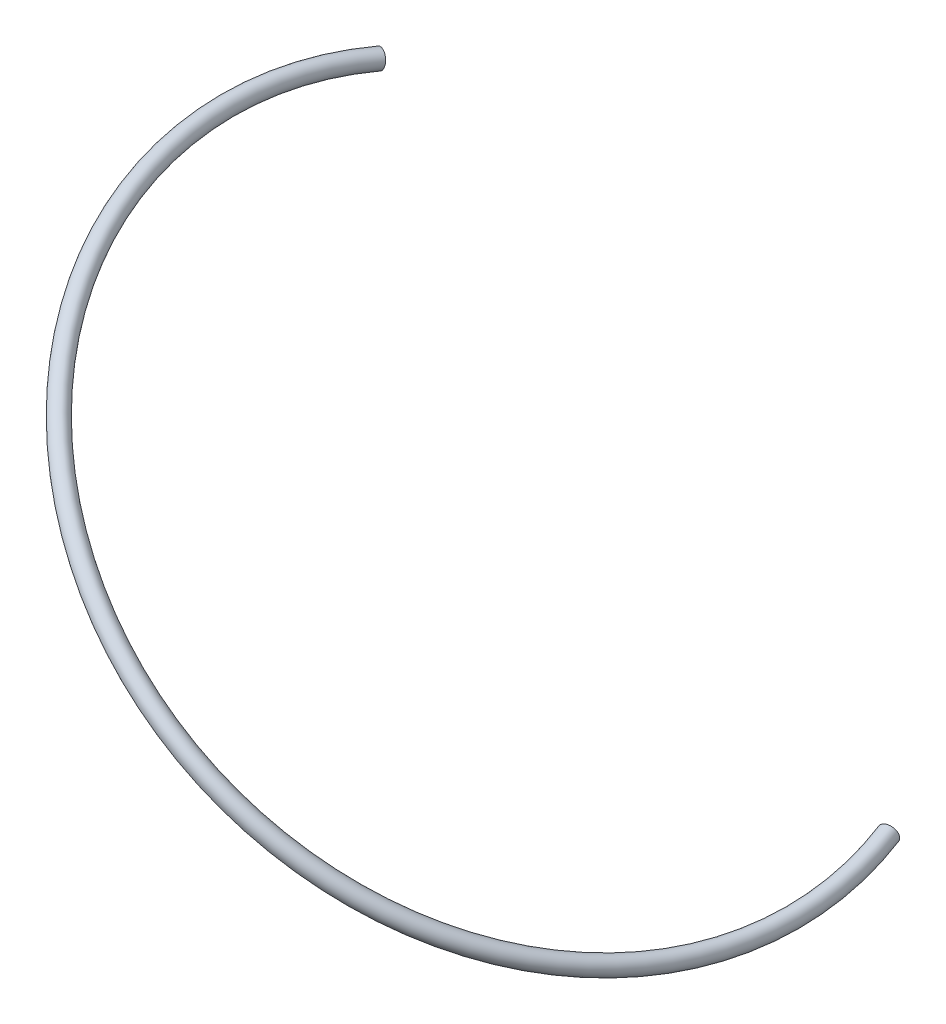
ISO-10303-21;
HEADER;
FILE_DESCRIPTION(('STEP AP214'),'2;1');
FILE_NAME('part.step','',(''),(''),'','','');
FILE_SCHEMA(('AUTOMOTIVE_DESIGN { 1 0 10303 214 1 1 1 1 }'));
ENDSEC;
DATA;
#1=APPLICATION_CONTEXT('core data for automotive mechanical design processes');
#2=APPLICATION_PROTOCOL_DEFINITION('international standard','automotive_design',2000,#1);
#3=PRODUCT_CONTEXT('',#1,'mechanical');
#4=PRODUCT('Part','Part','',(#3));
#5=PRODUCT_RELATED_PRODUCT_CATEGORY('part','',(#4));
#6=PRODUCT_DEFINITION_FORMATION('','',#4);
#7=PRODUCT_DEFINITION_CONTEXT('part definition',#1,'design');
#8=PRODUCT_DEFINITION('design','',#6,#7);
#9=PRODUCT_DEFINITION_SHAPE('','',#8);
#10=(LENGTH_UNIT() NAMED_UNIT(*) SI_UNIT(.MILLI.,.METRE.));
#11=(NAMED_UNIT(*) PLANE_ANGLE_UNIT() SI_UNIT($,.RADIAN.));
#12=(NAMED_UNIT(*) SI_UNIT($,.STERADIAN.) SOLID_ANGLE_UNIT());
#13=UNCERTAINTY_MEASURE_WITH_UNIT(LENGTH_MEASURE(1.E-05),#10,'distance_accuracy_value','');
#14=(GEOMETRIC_REPRESENTATION_CONTEXT(3) GLOBAL_UNCERTAINTY_ASSIGNED_CONTEXT((#13)) GLOBAL_UNIT_ASSIGNED_CONTEXT((#10,
#11,#12)) REPRESENTATION_CONTEXT('',''));
#15=CARTESIAN_POINT('',(0.,0.,0.));
#16=DIRECTION('',(0.,0.,1.));
#17=DIRECTION('',(1.,0.,0.));
#18=AXIS2_PLACEMENT_3D('',#15,#16,#17);
#19=CARTESIAN_POINT('',(121.250000000001,25.8499999999997,22.2500000000002));
#20=DIRECTION('',(-0.298566569644473,0.222488309848033,0.928093182537022));
#21=DIRECTION('',(0.951953557809445,0.,0.30624242647605));
#22=AXIS2_PLACEMENT_3D('',#19,#20,#21);
#23=PLANE('',#22);
#24=CARTESIAN_POINT('',(121.250000000001,25.8499999999997,22.2500000000002));
#25=DIRECTION('',(-0.298566569644473,0.222488309848033,0.928093182537022));
#26=DIRECTION('',(0.951953557809445,0.,0.30624242647605));
#27=AXIS2_PLACEMENT_3D('',#24,#25,#26);
#28=CIRCLE('',#27,1.99999999999999);
#29=CARTESIAN_POINT('',(119.761620385211,26.9591230518581,21.5053039693184));
#30=VERTEX_POINT('',#29);
#31=EDGE_CURVE('E53',#30,#30,#28,.T.);
#32=ORIENTED_EDGE('',*,*,#31,.F.);
#33=EDGE_LOOP('',(#32));
#34=FACE_BOUND('',#33,.T.);
#35=ADVANCED_FACE('F47',(#34),#23,.F.);
#36=CARTESIAN_POINT('',(240.75,-63.1999999999989,27.0000000000019));
#37=DIRECTION('',(-0.250570155264548,0.186721944153203,-0.949920792941363));
#38=DIRECTION('',(-0.286578546905339,0.922939614433892,0.257012070849294));
#39=AXIS2_PLACEMENT_3D('',#36,#37,#38);
#40=PLANE('',#39);
#41=CARTESIAN_POINT('',(240.75,-63.1999999999989,27.0000000000019));
#42=DIRECTION('',(-0.250570155264548,0.186721944153203,-0.949920792941363));
#43=DIRECTION('',(-0.286578546905339,0.922939614433892,0.257012070849294));
#44=AXIS2_PLACEMENT_3D('',#41,#42,#43);
#45=CIRCLE('',#44,1.99999999999999);
#46=CARTESIAN_POINT('',(242.273384473114,-64.3352082621809,26.3750184414335));
#47=VERTEX_POINT('',#46);
#48=EDGE_CURVE('E11',#47,#47,#45,.T.);
#49=ORIENTED_EDGE('',*,*,#48,.T.);
#50=EDGE_LOOP('',(#49));
#51=FACE_BOUND('',#50,.T.);
#52=ADVANCED_FACE('F62',(#51),#40,.T.);
#53=CARTESIAN_POINT('',(180.305543122316,-18.1574988706453,51.7978573583812));
#54=DIRECTION('',(0.597527852120656,0.801848156411222,0.));
#55=DIRECTION('',(-0.801848156411222,0.597527852120656,0.));
#56=AXIS2_PLACEMENT_3D('',#53,#54,#55);
#57=TOROIDAL_SURFACE('',#56,79.3554850328107,1.99999999999999);
#58=CARTESIAN_POINT('',(180.305543122316,-18.1574988706453,51.7978573583812));
#59=DIRECTION('',(0.597527852120656,0.801848156411222,0.));
#60=DIRECTION('',(-0.801848156411222,0.597527852120656,0.));
#61=AXIS2_PLACEMENT_3D('',#58,#59,#60);
#62=CIRCLE('',#61,81.3554850328107);
#63=EDGE_CURVE('',#30,#47,#62,.T.);
#64=ORIENTED_EDGE('',*,*,#31,.T.);
#65=ORIENTED_EDGE('',*,*,#48,.F.);
#66=ORIENTED_EDGE('',*,*,#63,.T.);
#67=ORIENTED_EDGE('',*,*,#63,.F.);
#68=EDGE_LOOP('',(#64,#66,#65,#67));
#69=FACE_BOUND('',#68,.T.);
#70=ADVANCED_FACE('F59',(#69),#57,.T.);
#71=CLOSED_SHELL('',(#35,#52,#70));
#72=MANIFOLD_SOLID_BREP('B2',#71);
#73=ADVANCED_BREP_SHAPE_REPRESENTATION('',(#18,#72),#14);
#74=SHAPE_DEFINITION_REPRESENTATION(#9,#73);
ENDSEC;
END-ISO-10303-21;
